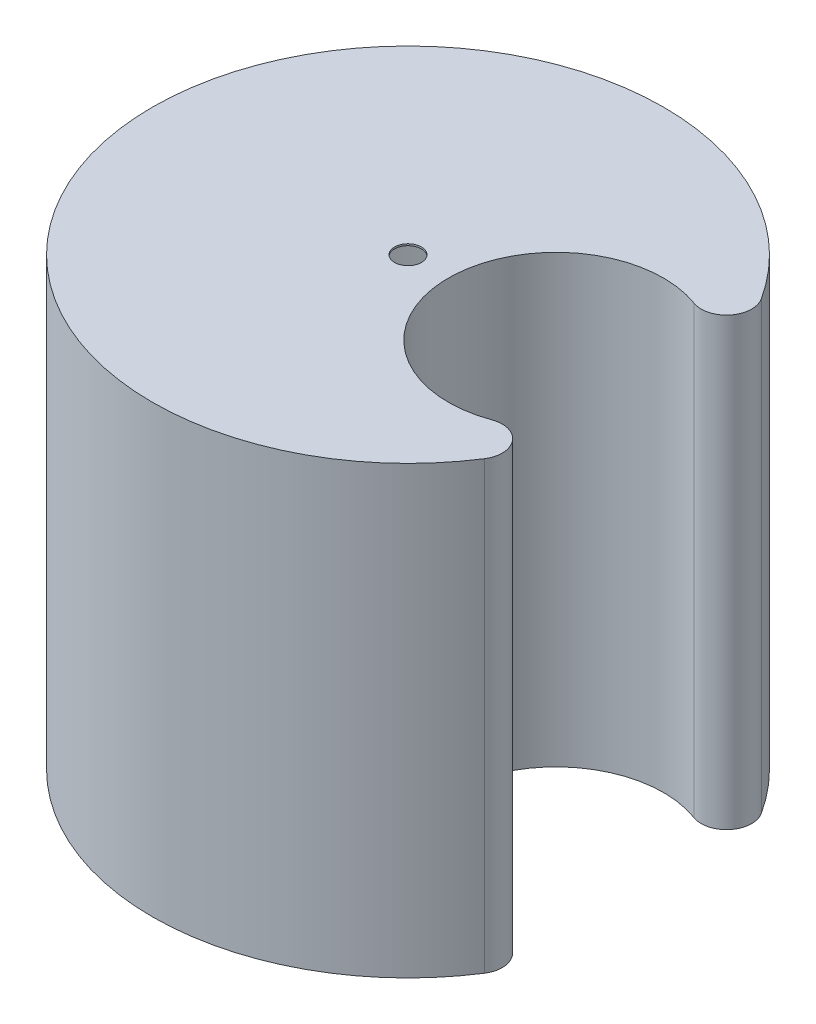
ISO-10303-21;
HEADER;
FILE_DESCRIPTION(('STEP AP214'),'2;1');
FILE_NAME('part.step','',(''),(''),'','','');
FILE_SCHEMA(('AUTOMOTIVE_DESIGN { 1 0 10303 214 1 1 1 1 }'));
ENDSEC;
DATA;
#1=APPLICATION_CONTEXT('core data for automotive mechanical design processes');
#2=APPLICATION_PROTOCOL_DEFINITION('international standard','automotive_design',2000,#1);
#3=PRODUCT_CONTEXT('',#1,'mechanical');
#4=PRODUCT('Part','Part','',(#3));
#5=PRODUCT_RELATED_PRODUCT_CATEGORY('part','',(#4));
#6=PRODUCT_DEFINITION_FORMATION('','',#4);
#7=PRODUCT_DEFINITION_CONTEXT('part definition',#1,'design');
#8=PRODUCT_DEFINITION('design','',#6,#7);
#9=PRODUCT_DEFINITION_SHAPE('','',#8);
#10=(LENGTH_UNIT() NAMED_UNIT(*) SI_UNIT(.MILLI.,.METRE.));
#11=(NAMED_UNIT(*) PLANE_ANGLE_UNIT() SI_UNIT($,.RADIAN.));
#12=(NAMED_UNIT(*) SI_UNIT($,.STERADIAN.) SOLID_ANGLE_UNIT());
#13=UNCERTAINTY_MEASURE_WITH_UNIT(LENGTH_MEASURE(1.E-05),#10,'distance_accuracy_value','');
#14=(GEOMETRIC_REPRESENTATION_CONTEXT(3) GLOBAL_UNCERTAINTY_ASSIGNED_CONTEXT((#13)) GLOBAL_UNIT_ASSIGNED_CONTEXT((#10,
#11,#12)) REPRESENTATION_CONTEXT('',''));
#15=CARTESIAN_POINT('',(0.,0.,0.));
#16=DIRECTION('',(0.,0.,1.));
#17=DIRECTION('',(1.,0.,0.));
#18=AXIS2_PLACEMENT_3D('',#15,#16,#17);
#19=CARTESIAN_POINT('',(0.,105.171875,0.));
#20=DIRECTION('',(0.,1.,0.));
#21=DIRECTION('',(0.,0.,1.));
#22=AXIS2_PLACEMENT_3D('',#19,#20,#21);
#23=PLANE('',#22);
#24=CARTESIAN_POINT('',(0.,105.171875,0.));
#25=DIRECTION('',(0.,-1.,0.));
#26=DIRECTION('',(0.,0.,-1.));
#27=AXIS2_PLACEMENT_3D('',#24,#25,#26);
#28=CIRCLE('',#27,3.175);
#29=CARTESIAN_POINT('',(0.,105.171875,-3.175));
#30=VERTEX_POINT('',#29);
#31=EDGE_CURVE('E197',#30,#30,#28,.T.);
#32=ORIENTED_EDGE('',*,*,#31,.T.);
#33=EDGE_LOOP('',(#32));
#34=FACE_BOUND('',#33,.T.);
#35=CARTESIAN_POINT('',(45.7127840909091,105.171875,-29.4387866882036));
#36=DIRECTION('',(0.,-1.,0.));
#37=DIRECTION('',(0.,0.,1.));
#38=AXIS2_PLACEMENT_3D('',#35,#36,#37);
#39=CIRCLE('',#38,5.953125);
#40=CARTESIAN_POINT('',(50.7178334439283,105.171875,-32.6620115080799));
#41=VERTEX_POINT('',#40);
#42=CARTESIAN_POINT('',(43.6644706559264,105.171875,-23.8491436461396));
#43=VERTEX_POINT('',#42);
#44=EDGE_CURVE('E122',#41,#43,#39,.T.);
#45=ORIENTED_EDGE('',*,*,#44,.F.);
#46=CARTESIAN_POINT('',(0.,105.171875,0.));
#47=DIRECTION('',(0.,-1.,0.));
#48=DIRECTION('',(0.,0.,-1.));
#49=AXIS2_PLACEMENT_3D('',#46,#47,#48);
#50=CIRCLE('',#49,60.325);
#51=CARTESIAN_POINT('',(50.7178334439283,105.171875,32.6620115080799));
#52=VERTEX_POINT('',#51);
#53=EDGE_CURVE('E11',#52,#41,#50,.T.);
#54=ORIENTED_EDGE('',*,*,#53,.F.);
#55=CARTESIAN_POINT('',(45.7127840909091,105.171875,29.4387866882036));
#56=DIRECTION('',(0.,-1.,0.));
#57=DIRECTION('',(0.,0.,-1.));
#58=AXIS2_PLACEMENT_3D('',#55,#56,#57);
#59=CIRCLE('',#58,5.953125);
#60=CARTESIAN_POINT('',(43.6644706559264,105.171875,23.8491436461396));
#61=VERTEX_POINT('',#60);
#62=EDGE_CURVE('E148',#61,#52,#59,.T.);
#63=ORIENTED_EDGE('',*,*,#62,.F.);
#64=CARTESIAN_POINT('',(34.925,105.171875,0.));
#65=DIRECTION('',(0.,1.,0.));
#66=DIRECTION('',(0.,0.,1.));
#67=AXIS2_PLACEMENT_3D('',#64,#65,#66);
#68=CIRCLE('',#67,25.4);
#69=EDGE_CURVE('E126',#43,#61,#68,.T.);
#70=ORIENTED_EDGE('',*,*,#69,.F.);
#71=EDGE_LOOP('',(#45,#54,#63,#70));
#72=FACE_BOUND('',#71,.T.);
#73=ADVANCED_FACE('F37',(#34,#72),#23,.T.);
#74=CARTESIAN_POINT('',(0.,0.,0.));
#75=DIRECTION('',(0.,-1.,0.));
#76=DIRECTION('',(0.,0.,-1.));
#77=AXIS2_PLACEMENT_3D('',#74,#75,#76);
#78=CYLINDRICAL_SURFACE('',#77,60.325);
#79=DIRECTION('',(0.,1.,0.));
#80=VECTOR('',#79,1.);
#81=CARTESIAN_POINT('',(50.7178334439283,0.,-32.6620115080799));
#82=LINE('',#81,#80);
#83=CARTESIAN_POINT('',(50.7178334439283,0.,-32.6620115080799));
#84=VERTEX_POINT('',#83);
#85=EDGE_CURVE('E156',#84,#41,#82,.T.);
#86=ORIENTED_EDGE('',*,*,#85,.F.);
#87=CARTESIAN_POINT('',(0.,0.,0.));
#88=DIRECTION('',(0.,-1.,0.));
#89=DIRECTION('',(0.,0.,-1.));
#90=AXIS2_PLACEMENT_3D('',#87,#88,#89);
#91=CIRCLE('',#90,60.325);
#92=CARTESIAN_POINT('',(50.7178334439283,0.,32.6620115080799));
#93=VERTEX_POINT('',#92);
#94=EDGE_CURVE('E44',#93,#84,#91,.T.);
#95=ORIENTED_EDGE('',*,*,#94,.F.);
#96=DIRECTION('',(0.,1.,0.));
#97=VECTOR('',#96,1.);
#98=CARTESIAN_POINT('',(50.7178334439283,0.,32.6620115080799));
#99=LINE('',#98,#97);
#100=EDGE_CURVE('E158',#93,#52,#99,.T.);
#101=ORIENTED_EDGE('',*,*,#100,.T.);
#102=ORIENTED_EDGE('',*,*,#53,.T.);
#103=EDGE_LOOP('',(#86,#95,#101,#102));
#104=FACE_BOUND('',#103,.T.);
#105=ADVANCED_FACE('F169',(#104),#78,.T.);
#106=CARTESIAN_POINT('',(59.928125,0.,0.));
#107=DIRECTION('',(0.,-1.,0.));
#108=DIRECTION('',(0.,0.,-1.));
#109=AXIS2_PLACEMENT_3D('',#106,#107,#108);
#110=PLANE('',#109);
#111=CARTESIAN_POINT('',(45.7127840909091,0.,-29.4387866882036));
#112=DIRECTION('',(0.,-1.,0.));
#113=DIRECTION('',(0.,0.,-1.));
#114=AXIS2_PLACEMENT_3D('',#111,#112,#113);
#115=CIRCLE('',#114,5.55625);
#116=CARTESIAN_POINT('',(50.3841634870604,0.,-32.4471298534215));
#117=VERTEX_POINT('',#116);
#118=CARTESIAN_POINT('',(43.8010248849252,0.,-24.2217865156106));
#119=VERTEX_POINT('',#118);
#120=EDGE_CURVE('E110',#117,#119,#115,.T.);
#121=ORIENTED_EDGE('',*,*,#120,.F.);
#122=CARTESIAN_POINT('',(0.,0.,0.));
#123=DIRECTION('',(0.,-1.,0.));
#124=DIRECTION('',(0.,0.,-1.));
#125=AXIS2_PLACEMENT_3D('',#122,#123,#124);
#126=CIRCLE('',#125,59.928125);
#127=CARTESIAN_POINT('',(50.3841634870604,0.,32.4471298534215));
#128=VERTEX_POINT('',#127);
#129=EDGE_CURVE('E123',#128,#117,#126,.T.);
#130=ORIENTED_EDGE('',*,*,#129,.F.);
#131=CARTESIAN_POINT('',(45.7127840909091,0.,29.4387866882036));
#132=DIRECTION('',(0.,-1.,0.));
#133=DIRECTION('',(0.,0.,-1.));
#134=AXIS2_PLACEMENT_3D('',#131,#132,#133);
#135=CIRCLE('',#134,5.55625);
#136=CARTESIAN_POINT('',(43.8010248849252,0.,24.2217865156106));
#137=VERTEX_POINT('',#136);
#138=EDGE_CURVE('E51',#137,#128,#135,.T.);
#139=ORIENTED_EDGE('',*,*,#138,.F.);
#140=CARTESIAN_POINT('',(34.925,0.,0.));
#141=DIRECTION('',(0.,-1.,0.));
#142=DIRECTION('',(0.,0.,-1.));
#143=AXIS2_PLACEMENT_3D('',#140,#141,#142);
#144=CIRCLE('',#143,25.796875);
#145=EDGE_CURVE('E140',#119,#137,#144,.F.);
#146=ORIENTED_EDGE('',*,*,#145,.F.);
#147=EDGE_LOOP('',(#121,#130,#139,#146));
#148=FACE_BOUND('',#147,.T.);
#149=CARTESIAN_POINT('',(45.7127840909091,0.,-29.4387866882036));
#150=DIRECTION('',(0.,-1.,0.));
#151=DIRECTION('',(0.,0.,1.));
#152=AXIS2_PLACEMENT_3D('',#149,#150,#151);
#153=CIRCLE('',#152,5.953125);
#154=CARTESIAN_POINT('',(43.6644706559264,0.,-23.8491436461396));
#155=VERTEX_POINT('',#154);
#156=EDGE_CURVE('E144',#84,#155,#153,.T.);
#157=ORIENTED_EDGE('',*,*,#156,.T.);
#158=CARTESIAN_POINT('',(34.925,0.,0.));
#159=DIRECTION('',(0.,1.,0.));
#160=DIRECTION('',(0.,0.,1.));
#161=AXIS2_PLACEMENT_3D('',#158,#159,#160);
#162=CIRCLE('',#161,25.4);
#163=CARTESIAN_POINT('',(43.6644706559264,0.,23.8491436461396));
#164=VERTEX_POINT('',#163);
#165=EDGE_CURVE('E147',#155,#164,#162,.T.);
#166=ORIENTED_EDGE('',*,*,#165,.T.);
#167=CARTESIAN_POINT('',(45.7127840909091,0.,29.4387866882036));
#168=DIRECTION('',(0.,-1.,0.));
#169=DIRECTION('',(0.,0.,-1.));
#170=AXIS2_PLACEMENT_3D('',#167,#168,#169);
#171=CIRCLE('',#170,5.953125);
#172=EDGE_CURVE('E59',#164,#93,#171,.T.);
#173=ORIENTED_EDGE('',*,*,#172,.T.);
#174=ORIENTED_EDGE('',*,*,#94,.T.);
#175=EDGE_LOOP('',(#157,#166,#173,#174));
#176=FACE_BOUND('',#175,.T.);
#177=ADVANCED_FACE('F166',(#148,#176),#110,.T.);
#178=CARTESIAN_POINT('',(45.7127840909091,0.,-29.4387866882036));
#179=DIRECTION('',(0.,1.,0.));
#180=DIRECTION('',(0.,0.,1.));
#181=AXIS2_PLACEMENT_3D('',#178,#179,#180);
#182=CYLINDRICAL_SURFACE('',#181,5.953125);
#183=ORIENTED_EDGE('',*,*,#44,.T.);
#184=DIRECTION('',(0.,1.,0.));
#185=VECTOR('',#184,1.);
#186=CARTESIAN_POINT('',(43.6644706559264,0.,-23.8491436461396));
#187=LINE('',#186,#185);
#188=EDGE_CURVE('E151',#155,#43,#187,.T.);
#189=ORIENTED_EDGE('',*,*,#188,.F.);
#190=ORIENTED_EDGE('',*,*,#156,.F.);
#191=ORIENTED_EDGE('',*,*,#85,.T.);
#192=EDGE_LOOP('',(#183,#189,#190,#191));
#193=FACE_BOUND('',#192,.T.);
#194=ADVANCED_FACE('F173',(#193),#182,.T.);
#195=CARTESIAN_POINT('',(45.7127840909091,0.,29.4387866882036));
#196=DIRECTION('',(0.,1.,0.));
#197=DIRECTION('',(0.,0.,1.));
#198=AXIS2_PLACEMENT_3D('',#195,#196,#197);
#199=CYLINDRICAL_SURFACE('',#198,5.953125);
#200=ORIENTED_EDGE('',*,*,#62,.T.);
#201=ORIENTED_EDGE('',*,*,#100,.F.);
#202=ORIENTED_EDGE('',*,*,#172,.F.);
#203=DIRECTION('',(0.,1.,0.));
#204=VECTOR('',#203,1.);
#205=CARTESIAN_POINT('',(43.6644706559264,0.,23.8491436461396));
#206=LINE('',#205,#204);
#207=EDGE_CURVE('E161',#164,#61,#206,.T.);
#208=ORIENTED_EDGE('',*,*,#207,.T.);
#209=EDGE_LOOP('',(#200,#201,#202,#208));
#210=FACE_BOUND('',#209,.T.);
#211=ADVANCED_FACE('F180',(#210),#199,.T.);
#212=CARTESIAN_POINT('',(34.925,0.,0.));
#213=DIRECTION('',(0.,1.,0.));
#214=DIRECTION('',(0.,0.,1.));
#215=AXIS2_PLACEMENT_3D('',#212,#213,#214);
#216=CYLINDRICAL_SURFACE('',#215,25.4);
#217=ORIENTED_EDGE('',*,*,#69,.T.);
#218=ORIENTED_EDGE('',*,*,#207,.F.);
#219=ORIENTED_EDGE('',*,*,#165,.F.);
#220=ORIENTED_EDGE('',*,*,#188,.T.);
#221=EDGE_LOOP('',(#217,#218,#219,#220));
#222=FACE_BOUND('',#221,.T.);
#223=ADVANCED_FACE('F178',(#222),#216,.F.);
#224=CARTESIAN_POINT('',(0.,104.775,0.));
#225=DIRECTION('',(0.,1.,0.));
#226=DIRECTION('',(0.,0.,1.));
#227=AXIS2_PLACEMENT_3D('',#224,#225,#226);
#228=PLANE('',#227);
#229=CARTESIAN_POINT('',(0.,104.775,0.));
#230=DIRECTION('',(0.,-1.,0.));
#231=DIRECTION('',(0.,0.,-1.));
#232=AXIS2_PLACEMENT_3D('',#229,#230,#231);
#233=CIRCLE('',#232,3.175);
#234=CARTESIAN_POINT('',(0.,104.775,-3.175));
#235=VERTEX_POINT('',#234);
#236=EDGE_CURVE('E199',#235,#235,#233,.T.);
#237=ORIENTED_EDGE('',*,*,#236,.F.);
#238=EDGE_LOOP('',(#237));
#239=FACE_BOUND('',#238,.T.);
#240=CARTESIAN_POINT('',(45.7127840909091,104.775,-29.4387866882036));
#241=DIRECTION('',(0.,1.,0.));
#242=DIRECTION('',(0.,0.,1.));
#243=AXIS2_PLACEMENT_3D('',#240,#241,#242);
#244=CIRCLE('',#243,5.55625);
#245=CARTESIAN_POINT('',(50.3841634870604,104.775,-32.4471298534215));
#246=VERTEX_POINT('',#245);
#247=CARTESIAN_POINT('',(43.8010248849252,104.775,-24.2217865156106));
#248=VERTEX_POINT('',#247);
#249=EDGE_CURVE('E130',#246,#248,#244,.F.);
#250=ORIENTED_EDGE('',*,*,#249,.T.);
#251=CARTESIAN_POINT('',(34.925,104.775,0.));
#252=DIRECTION('',(0.,1.,0.));
#253=DIRECTION('',(0.,0.,1.));
#254=AXIS2_PLACEMENT_3D('',#251,#252,#253);
#255=CIRCLE('',#254,25.796875);
#256=CARTESIAN_POINT('',(43.8010248849252,104.775,24.2217865156106));
#257=VERTEX_POINT('',#256);
#258=EDGE_CURVE('E109',#248,#257,#255,.T.);
#259=ORIENTED_EDGE('',*,*,#258,.T.);
#260=CARTESIAN_POINT('',(45.7127840909091,104.775,29.4387866882036));
#261=DIRECTION('',(0.,1.,0.));
#262=DIRECTION('',(0.,0.,1.));
#263=AXIS2_PLACEMENT_3D('',#260,#261,#262);
#264=CIRCLE('',#263,5.55625);
#265=CARTESIAN_POINT('',(50.3841634870604,104.775,32.4471298534215));
#266=VERTEX_POINT('',#265);
#267=EDGE_CURVE('E103',#257,#266,#264,.F.);
#268=ORIENTED_EDGE('',*,*,#267,.T.);
#269=CARTESIAN_POINT('',(0.,104.775,0.));
#270=DIRECTION('',(0.,1.,0.));
#271=DIRECTION('',(0.,0.,1.));
#272=AXIS2_PLACEMENT_3D('',#269,#270,#271);
#273=CIRCLE('',#272,59.928125);
#274=EDGE_CURVE('E107',#266,#246,#273,.F.);
#275=ORIENTED_EDGE('',*,*,#274,.T.);
#276=EDGE_LOOP('',(#250,#259,#268,#275));
#277=FACE_BOUND('',#276,.T.);
#278=ADVANCED_FACE('F105',(#239,#277),#228,.F.);
#279=CARTESIAN_POINT('',(0.,0.,0.));
#280=DIRECTION('',(0.,-1.,0.));
#281=DIRECTION('',(0.,0.,-1.));
#282=AXIS2_PLACEMENT_3D('',#279,#280,#281);
#283=CYLINDRICAL_SURFACE('',#282,59.928125);
#284=DIRECTION('',(0.,1.,0.));
#285=VECTOR('',#284,1.);
#286=CARTESIAN_POINT('',(50.3841634870604,0.,-32.4471298534215));
#287=LINE('',#286,#285);
#288=EDGE_CURVE('E117',#117,#246,#287,.T.);
#289=ORIENTED_EDGE('',*,*,#288,.T.);
#290=ORIENTED_EDGE('',*,*,#274,.F.);
#291=DIRECTION('',(0.,-1.,0.));
#292=VECTOR('',#291,1.);
#293=CARTESIAN_POINT('',(50.3841634870604,0.,32.4471298534215));
#294=LINE('',#293,#292);
#295=EDGE_CURVE('E112',#128,#266,#294,.F.);
#296=ORIENTED_EDGE('',*,*,#295,.F.);
#297=ORIENTED_EDGE('',*,*,#129,.T.);
#298=EDGE_LOOP('',(#289,#290,#296,#297));
#299=FACE_BOUND('',#298,.T.);
#300=ADVANCED_FACE('F120',(#299),#283,.F.);
#301=CARTESIAN_POINT('',(45.7127840909091,0.,-29.4387866882036));
#302=DIRECTION('',(0.,1.,0.));
#303=DIRECTION('',(0.,0.,1.));
#304=AXIS2_PLACEMENT_3D('',#301,#302,#303);
#305=CYLINDRICAL_SURFACE('',#304,5.55625);
#306=ORIENTED_EDGE('',*,*,#249,.F.);
#307=ORIENTED_EDGE('',*,*,#288,.F.);
#308=ORIENTED_EDGE('',*,*,#120,.T.);
#309=DIRECTION('',(0.,1.,0.));
#310=VECTOR('',#309,1.);
#311=CARTESIAN_POINT('',(43.8010248849252,0.,-24.2217865156106));
#312=LINE('',#311,#310);
#313=EDGE_CURVE('E135',#119,#248,#312,.T.);
#314=ORIENTED_EDGE('',*,*,#313,.T.);
#315=EDGE_LOOP('',(#306,#307,#308,#314));
#316=FACE_BOUND('',#315,.T.);
#317=ADVANCED_FACE('F211',(#316),#305,.F.);
#318=CARTESIAN_POINT('',(45.7127840909091,0.,29.4387866882036));
#319=DIRECTION('',(0.,1.,0.));
#320=DIRECTION('',(0.,0.,1.));
#321=AXIS2_PLACEMENT_3D('',#318,#319,#320);
#322=CYLINDRICAL_SURFACE('',#321,5.55625);
#323=ORIENTED_EDGE('',*,*,#267,.F.);
#324=DIRECTION('',(0.,1.,0.));
#325=VECTOR('',#324,1.);
#326=CARTESIAN_POINT('',(43.8010248849252,0.,24.2217865156106));
#327=LINE('',#326,#325);
#328=EDGE_CURVE('E118',#137,#257,#327,.T.);
#329=ORIENTED_EDGE('',*,*,#328,.F.);
#330=ORIENTED_EDGE('',*,*,#138,.T.);
#331=ORIENTED_EDGE('',*,*,#295,.T.);
#332=EDGE_LOOP('',(#323,#329,#330,#331));
#333=FACE_BOUND('',#332,.T.);
#334=ADVANCED_FACE('F113',(#333),#322,.F.);
#335=CARTESIAN_POINT('',(34.925,0.,0.));
#336=DIRECTION('',(0.,1.,0.));
#337=DIRECTION('',(0.,0.,1.));
#338=AXIS2_PLACEMENT_3D('',#335,#336,#337);
#339=CYLINDRICAL_SURFACE('',#338,25.796875);
#340=ORIENTED_EDGE('',*,*,#258,.F.);
#341=ORIENTED_EDGE('',*,*,#313,.F.);
#342=ORIENTED_EDGE('',*,*,#145,.T.);
#343=ORIENTED_EDGE('',*,*,#328,.T.);
#344=EDGE_LOOP('',(#340,#341,#342,#343));
#345=FACE_BOUND('',#344,.T.);
#346=ADVANCED_FACE('F219',(#345),#339,.T.);
#347=CARTESIAN_POINT('',(0.,105.171875,0.));
#348=DIRECTION('',(0.,-1.,0.));
#349=DIRECTION('',(0.,0.,-1.));
#350=AXIS2_PLACEMENT_3D('',#347,#348,#349);
#351=CYLINDRICAL_SURFACE('',#350,3.175);
#352=ORIENTED_EDGE('',*,*,#31,.F.);
#353=EDGE_LOOP('',(#352));
#354=FACE_BOUND('',#353,.T.);
#355=ORIENTED_EDGE('',*,*,#236,.T.);
#356=EDGE_LOOP('',(#355));
#357=FACE_BOUND('',#356,.T.);
#358=ADVANCED_FACE('F204',(#354,#357),#351,.F.);
#359=CLOSED_SHELL('',(#73,#105,#177,#194,#211,#223,#278,#300,#317,#334,#346,#358));
#360=MANIFOLD_SOLID_BREP('B2',#359);
#361=ADVANCED_BREP_SHAPE_REPRESENTATION('',(#18,#360),#14);
#362=SHAPE_DEFINITION_REPRESENTATION(#9,#361);
ENDSEC;
END-ISO-10303-21;
